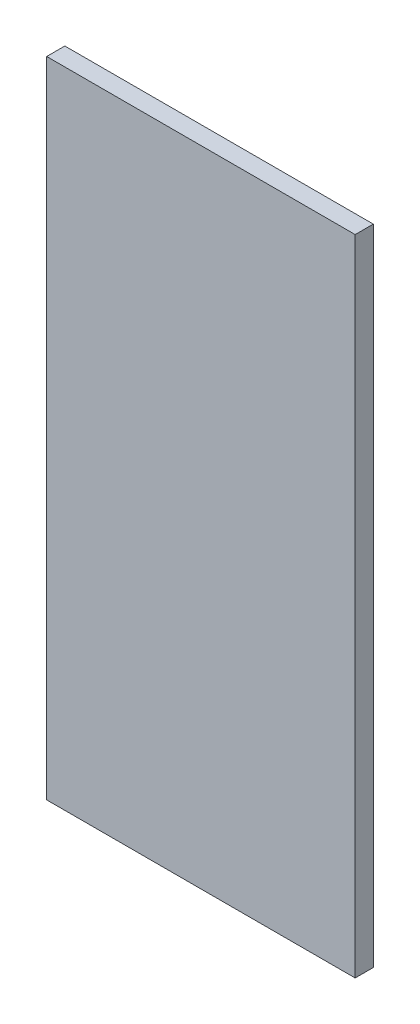
ISO-10303-21;
HEADER;
FILE_DESCRIPTION(('STEP AP214'),'2;1');
FILE_NAME('part.step','',(''),(''),'','','');
FILE_SCHEMA(('AUTOMOTIVE_DESIGN { 1 0 10303 214 1 1 1 1 }'));
ENDSEC;
DATA;
#1=APPLICATION_CONTEXT('core data for automotive mechanical design processes');
#2=APPLICATION_PROTOCOL_DEFINITION('international standard','automotive_design',2000,#1);
#3=PRODUCT_CONTEXT('',#1,'mechanical');
#4=PRODUCT('Part','Part','',(#3));
#5=PRODUCT_RELATED_PRODUCT_CATEGORY('part','',(#4));
#6=PRODUCT_DEFINITION_FORMATION('','',#4);
#7=PRODUCT_DEFINITION_CONTEXT('part definition',#1,'design');
#8=PRODUCT_DEFINITION('design','',#6,#7);
#9=PRODUCT_DEFINITION_SHAPE('','',#8);
#10=(LENGTH_UNIT() NAMED_UNIT(*) SI_UNIT(.MILLI.,.METRE.));
#11=(NAMED_UNIT(*) PLANE_ANGLE_UNIT() SI_UNIT($,.RADIAN.));
#12=(NAMED_UNIT(*) SI_UNIT($,.STERADIAN.) SOLID_ANGLE_UNIT());
#13=UNCERTAINTY_MEASURE_WITH_UNIT(LENGTH_MEASURE(1.E-05),#10,'distance_accuracy_value','');
#14=(GEOMETRIC_REPRESENTATION_CONTEXT(3) GLOBAL_UNCERTAINTY_ASSIGNED_CONTEXT((#13)) GLOBAL_UNIT_ASSIGNED_CONTEXT((#10,
#11,#12)) REPRESENTATION_CONTEXT('',''));
#15=CARTESIAN_POINT('',(0.,0.,0.));
#16=DIRECTION('',(0.,0.,1.));
#17=DIRECTION('',(1.,0.,0.));
#18=AXIS2_PLACEMENT_3D('',#15,#16,#17);
#19=CARTESIAN_POINT('',(0.,0.,3.));
#20=DIRECTION('',(1.,0.,0.));
#21=DIRECTION('',(0.,0.,-1.));
#22=AXIS2_PLACEMENT_3D('',#19,#20,#21);
#23=PLANE('',#22);
#24=DIRECTION('',(0.,-1.,0.));
#25=VECTOR('',#24,1.);
#26=CARTESIAN_POINT('',(0.,0.,0.));
#27=LINE('',#26,#25);
#28=CARTESIAN_POINT('',(0.,106.45,0.));
#29=VERTEX_POINT('',#28);
#30=CARTESIAN_POINT('',(0.,0.,0.));
#31=VERTEX_POINT('',#30);
#32=EDGE_CURVE('E96',#29,#31,#27,.T.);
#33=ORIENTED_EDGE('',*,*,#32,.T.);
#34=DIRECTION('',(0.,0.,-1.));
#35=VECTOR('',#34,1.);
#36=CARTESIAN_POINT('',(0.,0.,3.));
#37=LINE('',#36,#35);
#38=CARTESIAN_POINT('',(0.,0.,3.));
#39=VERTEX_POINT('',#38);
#40=EDGE_CURVE('E11',#39,#31,#37,.T.);
#41=ORIENTED_EDGE('',*,*,#40,.F.);
#42=DIRECTION('',(0.,-1.,0.));
#43=VECTOR('',#42,1.);
#44=CARTESIAN_POINT('',(0.,0.,3.));
#45=LINE('',#44,#43);
#46=CARTESIAN_POINT('',(0.,106.45,3.));
#47=VERTEX_POINT('',#46);
#48=EDGE_CURVE('E84',#47,#39,#45,.T.);
#49=ORIENTED_EDGE('',*,*,#48,.F.);
#50=DIRECTION('',(0.,0.,-1.));
#51=VECTOR('',#50,1.);
#52=CARTESIAN_POINT('',(0.,106.45,3.));
#53=LINE('',#52,#51);
#54=EDGE_CURVE('E92',#47,#29,#53,.T.);
#55=ORIENTED_EDGE('',*,*,#54,.T.);
#56=EDGE_LOOP('',(#33,#41,#49,#55));
#57=FACE_BOUND('',#56,.T.);
#58=ADVANCED_FACE('F33',(#57),#23,.F.);
#59=CARTESIAN_POINT('',(0.,0.,3.));
#60=DIRECTION('',(0.,1.,0.));
#61=DIRECTION('',(0.,0.,1.));
#62=AXIS2_PLACEMENT_3D('',#59,#60,#61);
#63=PLANE('',#62);
#64=DIRECTION('',(1.,0.,0.));
#65=VECTOR('',#64,1.);
#66=CARTESIAN_POINT('',(0.,0.,0.));
#67=LINE('',#66,#65);
#68=CARTESIAN_POINT('',(51.,0.,0.));
#69=VERTEX_POINT('',#68);
#70=EDGE_CURVE('E88',#31,#69,#67,.T.);
#71=ORIENTED_EDGE('',*,*,#70,.T.);
#72=DIRECTION('',(0.,0.,-1.));
#73=VECTOR('',#72,1.);
#74=CARTESIAN_POINT('',(51.,0.,3.));
#75=LINE('',#74,#73);
#76=CARTESIAN_POINT('',(51.,0.,3.));
#77=VERTEX_POINT('',#76);
#78=EDGE_CURVE('E41',#77,#69,#75,.T.);
#79=ORIENTED_EDGE('',*,*,#78,.F.);
#80=DIRECTION('',(1.,0.,0.));
#81=VECTOR('',#80,1.);
#82=CARTESIAN_POINT('',(0.,0.,3.));
#83=LINE('',#82,#81);
#84=EDGE_CURVE('E79',#39,#77,#83,.T.);
#85=ORIENTED_EDGE('',*,*,#84,.F.);
#86=ORIENTED_EDGE('',*,*,#40,.T.);
#87=EDGE_LOOP('',(#71,#79,#85,#86));
#88=FACE_BOUND('',#87,.T.);
#89=ADVANCED_FACE('F87',(#88),#63,.F.);
#90=CARTESIAN_POINT('',(51.,0.,3.));
#91=DIRECTION('',(-1.,0.,0.));
#92=DIRECTION('',(0.,0.,1.));
#93=AXIS2_PLACEMENT_3D('',#90,#91,#92);
#94=PLANE('',#93);
#95=DIRECTION('',(0.,1.,0.));
#96=VECTOR('',#95,1.);
#97=CARTESIAN_POINT('',(51.,0.,0.));
#98=LINE('',#97,#96);
#99=CARTESIAN_POINT('',(51.,106.45,0.));
#100=VERTEX_POINT('',#99);
#101=EDGE_CURVE('E66',#69,#100,#98,.T.);
#102=ORIENTED_EDGE('',*,*,#101,.T.);
#103=DIRECTION('',(0.,0.,-1.));
#104=VECTOR('',#103,1.);
#105=CARTESIAN_POINT('',(51.,106.45,3.));
#106=LINE('',#105,#104);
#107=CARTESIAN_POINT('',(51.,106.45,3.));
#108=VERTEX_POINT('',#107);
#109=EDGE_CURVE('E89',#108,#100,#106,.T.);
#110=ORIENTED_EDGE('',*,*,#109,.F.);
#111=DIRECTION('',(0.,1.,0.));
#112=VECTOR('',#111,1.);
#113=CARTESIAN_POINT('',(51.,0.,3.));
#114=LINE('',#113,#112);
#115=EDGE_CURVE('E82',#77,#108,#114,.T.);
#116=ORIENTED_EDGE('',*,*,#115,.F.);
#117=ORIENTED_EDGE('',*,*,#78,.T.);
#118=EDGE_LOOP('',(#102,#110,#116,#117));
#119=FACE_BOUND('',#118,.T.);
#120=ADVANCED_FACE('F90',(#119),#94,.F.);
#121=CARTESIAN_POINT('',(0.,106.45,3.));
#122=DIRECTION('',(0.,-1.,0.));
#123=DIRECTION('',(0.,0.,-1.));
#124=AXIS2_PLACEMENT_3D('',#121,#122,#123);
#125=PLANE('',#124);
#126=DIRECTION('',(-1.,0.,0.));
#127=VECTOR('',#126,1.);
#128=CARTESIAN_POINT('',(0.,106.45,0.));
#129=LINE('',#128,#127);
#130=EDGE_CURVE('E72',#100,#29,#129,.T.);
#131=ORIENTED_EDGE('',*,*,#130,.T.);
#132=ORIENTED_EDGE('',*,*,#54,.F.);
#133=DIRECTION('',(-1.,0.,0.));
#134=VECTOR('',#133,1.);
#135=CARTESIAN_POINT('',(0.,106.45,3.));
#136=LINE('',#135,#134);
#137=EDGE_CURVE('E49',#108,#47,#136,.T.);
#138=ORIENTED_EDGE('',*,*,#137,.F.);
#139=ORIENTED_EDGE('',*,*,#109,.T.);
#140=EDGE_LOOP('',(#131,#132,#138,#139));
#141=FACE_BOUND('',#140,.T.);
#142=ADVANCED_FACE('F103',(#141),#125,.F.);
#143=CARTESIAN_POINT('',(0.,0.,3.));
#144=DIRECTION('',(0.,0.,-1.));
#145=DIRECTION('',(-1.,0.,0.));
#146=AXIS2_PLACEMENT_3D('',#143,#144,#145);
#147=PLANE('',#146);
#148=ORIENTED_EDGE('',*,*,#48,.T.);
#149=ORIENTED_EDGE('',*,*,#84,.T.);
#150=ORIENTED_EDGE('',*,*,#115,.T.);
#151=ORIENTED_EDGE('',*,*,#137,.T.);
#152=EDGE_LOOP('',(#148,#149,#150,#151));
#153=FACE_BOUND('',#152,.T.);
#154=ADVANCED_FACE('F80',(#153),#147,.F.);
#155=CARTESIAN_POINT('',(0.,0.,0.));
#156=DIRECTION('',(0.,0.,-1.));
#157=DIRECTION('',(-1.,0.,0.));
#158=AXIS2_PLACEMENT_3D('',#155,#156,#157);
#159=PLANE('',#158);
#160=ORIENTED_EDGE('',*,*,#32,.F.);
#161=ORIENTED_EDGE('',*,*,#130,.F.);
#162=ORIENTED_EDGE('',*,*,#101,.F.);
#163=ORIENTED_EDGE('',*,*,#70,.F.);
#164=EDGE_LOOP('',(#160,#161,#162,#163));
#165=FACE_BOUND('',#164,.T.);
#166=ADVANCED_FACE('F106',(#165),#159,.T.);
#167=CLOSED_SHELL('',(#58,#89,#120,#142,#154,#166));
#168=MANIFOLD_SOLID_BREP('B2',#167);
#169=ADVANCED_BREP_SHAPE_REPRESENTATION('',(#18,#168),#14);
#170=SHAPE_DEFINITION_REPRESENTATION(#9,#169);
ENDSEC;
END-ISO-10303-21;
